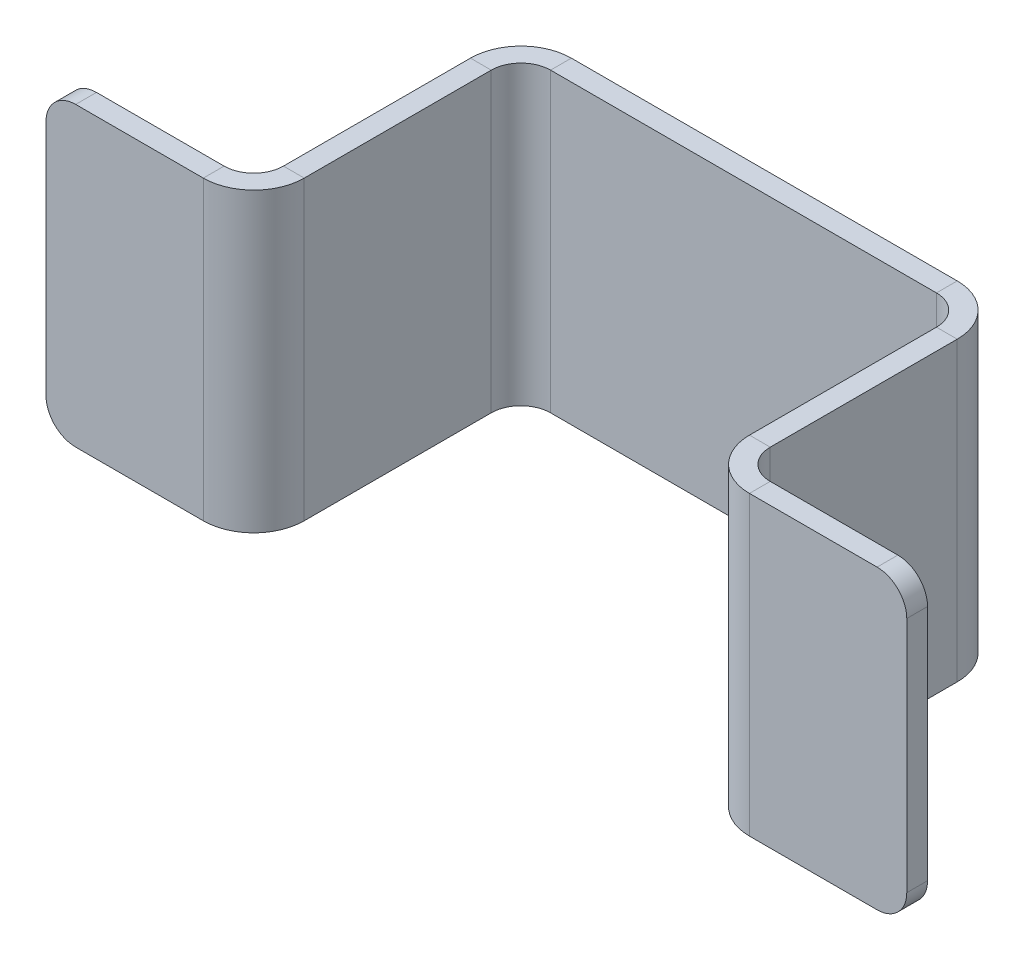
ISO-10303-21;
HEADER;
FILE_DESCRIPTION(('STEP AP214'),'2;1');
FILE_NAME('part.step','',(''),(''),'','','');
FILE_SCHEMA(('AUTOMOTIVE_DESIGN { 1 0 10303 214 1 1 1 1 }'));
ENDSEC;
DATA;
#1=APPLICATION_CONTEXT('core data for automotive mechanical design processes');
#2=APPLICATION_PROTOCOL_DEFINITION('international standard','automotive_design',2000,#1);
#3=PRODUCT_CONTEXT('',#1,'mechanical');
#4=PRODUCT('Part','Part','',(#3));
#5=PRODUCT_RELATED_PRODUCT_CATEGORY('part','',(#4));
#6=PRODUCT_DEFINITION_FORMATION('','',#4);
#7=PRODUCT_DEFINITION_CONTEXT('part definition',#1,'design');
#8=PRODUCT_DEFINITION('design','',#6,#7);
#9=PRODUCT_DEFINITION_SHAPE('','',#8);
#10=(LENGTH_UNIT() NAMED_UNIT(*) SI_UNIT(.MILLI.,.METRE.));
#11=(NAMED_UNIT(*) PLANE_ANGLE_UNIT() SI_UNIT($,.RADIAN.));
#12=(NAMED_UNIT(*) SI_UNIT($,.STERADIAN.) SOLID_ANGLE_UNIT());
#13=UNCERTAINTY_MEASURE_WITH_UNIT(LENGTH_MEASURE(1.E-05),#10,'distance_accuracy_value','');
#14=(GEOMETRIC_REPRESENTATION_CONTEXT(3) GLOBAL_UNCERTAINTY_ASSIGNED_CONTEXT((#13)) GLOBAL_UNIT_ASSIGNED_CONTEXT((#10,
#11,#12)) REPRESENTATION_CONTEXT('',''));
#15=CARTESIAN_POINT('',(0.,0.,0.));
#16=DIRECTION('',(0.,0.,1.));
#17=DIRECTION('',(1.,0.,0.));
#18=AXIS2_PLACEMENT_3D('',#15,#16,#17);
#19=CARTESIAN_POINT('',(-8.2,5.,0.));
#20=DIRECTION('',(0.,-1.,0.));
#21=DIRECTION('',(1.,0.,0.));
#22=AXIS2_PLACEMENT_3D('',#19,#20,#21);
#23=PLANE('',#22);
#24=DIRECTION('',(1.,0.,0.));
#25=VECTOR('',#24,1.);
#26=CARTESIAN_POINT('',(-8.20000000000002,4.99999999999999,7.3));
#27=LINE('',#26,#25);
#28=CARTESIAN_POINT('',(-8.20000000000002,4.99999999999999,7.3));
#29=VERTEX_POINT('',#28);
#30=CARTESIAN_POINT('',(-7.50000000000002,4.99999999999999,7.30000000000001));
#31=VERTEX_POINT('',#30);
#32=EDGE_CURVE('E253',#29,#31,#27,.T.);
#33=ORIENTED_EDGE('',*,*,#32,.T.);
#34=DIRECTION('',(0.,0.,-1.));
#35=VECTOR('',#34,1.);
#36=CARTESIAN_POINT('',(-7.5,5.,0.));
#37=LINE('',#36,#35);
#38=CARTESIAN_POINT('',(-7.5,4.99999999999999,0.999999999999997));
#39=VERTEX_POINT('',#38);
#40=EDGE_CURVE('E366',#31,#39,#37,.T.);
#41=ORIENTED_EDGE('',*,*,#40,.T.);
#42=DIRECTION('',(-1.,0.,0.));
#43=VECTOR('',#42,1.);
#44=CARTESIAN_POINT('',(-7.5,4.99999999999999,0.999999999999997));
#45=LINE('',#44,#43);
#46=CARTESIAN_POINT('',(-8.2,4.99999999999999,0.999999999999994));
#47=VERTEX_POINT('',#46);
#48=EDGE_CURVE('E353',#39,#47,#45,.T.);
#49=ORIENTED_EDGE('',*,*,#48,.T.);
#50=DIRECTION('',(0.,0.,-1.));
#51=VECTOR('',#50,1.);
#52=CARTESIAN_POINT('',(-8.2,5.,0.));
#53=LINE('',#52,#51);
#54=EDGE_CURVE('E367',#29,#47,#53,.T.);
#55=ORIENTED_EDGE('',*,*,#54,.F.);
#56=EDGE_LOOP('',(#33,#41,#49,#55));
#57=FACE_BOUND('',#56,.T.);
#58=ADVANCED_FACE('F39',(#57),#23,.F.);
#59=CARTESIAN_POINT('',(-8.20000000000002,-5.,8.3));
#60=DIRECTION('',(0.,1.,0.));
#61=DIRECTION('',(-1.,0.,0.));
#62=AXIS2_PLACEMENT_3D('',#59,#60,#61);
#63=PLANE('',#62);
#64=DIRECTION('',(1.,0.,0.));
#65=VECTOR('',#64,1.);
#66=CARTESIAN_POINT('',(-8.20000000000002,-5.,7.3));
#67=LINE('',#66,#65);
#68=CARTESIAN_POINT('',(-8.20000000000002,-5.,7.3));
#69=VERTEX_POINT('',#68);
#70=CARTESIAN_POINT('',(-7.50000000000002,-5.,7.3));
#71=VERTEX_POINT('',#70);
#72=EDGE_CURVE('E260',#69,#71,#67,.T.);
#73=ORIENTED_EDGE('',*,*,#72,.F.);
#74=DIRECTION('',(0.,0.,1.));
#75=VECTOR('',#74,1.);
#76=CARTESIAN_POINT('',(-8.20000000000002,-5.,8.3));
#77=LINE('',#76,#75);
#78=CARTESIAN_POINT('',(-8.2,-5.,0.999999999999994));
#79=VERTEX_POINT('',#78);
#80=EDGE_CURVE('E369',#79,#69,#77,.T.);
#81=ORIENTED_EDGE('',*,*,#80,.F.);
#82=DIRECTION('',(-1.,0.,0.));
#83=VECTOR('',#82,1.);
#84=CARTESIAN_POINT('',(-7.5,-5.,0.999999999999997));
#85=LINE('',#84,#83);
#86=CARTESIAN_POINT('',(-7.5,-5.,0.999999999999997));
#87=VERTEX_POINT('',#86);
#88=EDGE_CURVE('E358',#87,#79,#85,.T.);
#89=ORIENTED_EDGE('',*,*,#88,.F.);
#90=DIRECTION('',(0.,0.,1.));
#91=VECTOR('',#90,1.);
#92=CARTESIAN_POINT('',(-7.50000000000002,-5.,8.3));
#93=LINE('',#92,#91);
#94=EDGE_CURVE('E370',#87,#71,#93,.T.);
#95=ORIENTED_EDGE('',*,*,#94,.T.);
#96=EDGE_LOOP('',(#73,#81,#89,#95));
#97=FACE_BOUND('',#96,.T.);
#98=ADVANCED_FACE('F527',(#97),#63,.F.);
#99=CARTESIAN_POINT('',(-8.2,0.,0.));
#100=DIRECTION('',(1.,0.,0.));
#101=DIRECTION('',(0.,0.,-1.));
#102=AXIS2_PLACEMENT_3D('',#99,#100,#101);
#103=PLANE('',#102);
#104=DIRECTION('',(0.,1.,0.));
#105=VECTOR('',#104,1.);
#106=CARTESIAN_POINT('',(-8.20000000000002,4.99999999999999,7.3));
#107=LINE('',#106,#105);
#108=EDGE_CURVE('E257',#29,#69,#107,.F.);
#109=ORIENTED_EDGE('',*,*,#108,.F.);
#110=ORIENTED_EDGE('',*,*,#54,.T.);
#111=DIRECTION('',(0.,1.,0.));
#112=VECTOR('',#111,1.);
#113=CARTESIAN_POINT('',(-8.2,0.,0.999999999999994));
#114=LINE('',#113,#112);
#115=EDGE_CURVE('E361',#79,#47,#114,.T.);
#116=ORIENTED_EDGE('',*,*,#115,.F.);
#117=ORIENTED_EDGE('',*,*,#80,.T.);
#118=EDGE_LOOP('',(#109,#110,#116,#117));
#119=FACE_BOUND('',#118,.T.);
#120=ADVANCED_FACE('F524',(#119),#103,.F.);
#121=CARTESIAN_POINT('',(-7.5,0.,0.));
#122=DIRECTION('',(1.,0.,0.));
#123=DIRECTION('',(0.,0.,-1.));
#124=AXIS2_PLACEMENT_3D('',#121,#122,#123);
#125=PLANE('',#124);
#126=ORIENTED_EDGE('',*,*,#40,.F.);
#127=DIRECTION('',(0.,1.,0.));
#128=VECTOR('',#127,1.);
#129=CARTESIAN_POINT('',(-7.50000000000002,4.99999999999999,7.30000000000001));
#130=LINE('',#129,#128);
#131=EDGE_CURVE('E210',#31,#71,#130,.F.);
#132=ORIENTED_EDGE('',*,*,#131,.T.);
#133=ORIENTED_EDGE('',*,*,#94,.F.);
#134=DIRECTION('',(0.,-1.,0.));
#135=VECTOR('',#134,1.);
#136=CARTESIAN_POINT('',(-7.5,4.99999999999999,0.999999999999997));
#137=LINE('',#136,#135);
#138=EDGE_CURVE('E356',#39,#87,#137,.T.);
#139=ORIENTED_EDGE('',*,*,#138,.F.);
#140=EDGE_LOOP('',(#126,#132,#133,#139));
#141=FACE_BOUND('',#140,.T.);
#142=ADVANCED_FACE('F535',(#141),#125,.T.);
#143=CARTESIAN_POINT('',(8.2,-5.,0.));
#144=DIRECTION('',(0.,1.,0.));
#145=DIRECTION('',(-1.,0.,0.));
#146=AXIS2_PLACEMENT_3D('',#143,#144,#145);
#147=PLANE('',#146);
#148=DIRECTION('',(-1.,0.,0.));
#149=VECTOR('',#148,1.);
#150=CARTESIAN_POINT('',(8.20000000000002,-4.99999999999999,7.3));
#151=LINE('',#150,#149);
#152=CARTESIAN_POINT('',(8.20000000000002,-4.99999999999999,7.3));
#153=VERTEX_POINT('',#152);
#154=CARTESIAN_POINT('',(7.50000000000002,-4.99999999999999,7.30000000000001));
#155=VERTEX_POINT('',#154);
#156=EDGE_CURVE('E296',#153,#155,#151,.T.);
#157=ORIENTED_EDGE('',*,*,#156,.T.);
#158=DIRECTION('',(0.,0.,-1.));
#159=VECTOR('',#158,1.);
#160=CARTESIAN_POINT('',(7.5,-5.,0.));
#161=LINE('',#160,#159);
#162=CARTESIAN_POINT('',(7.50000000000001,-5.,0.999999999999997));
#163=VERTEX_POINT('',#162);
#164=EDGE_CURVE('E322',#155,#163,#161,.T.);
#165=ORIENTED_EDGE('',*,*,#164,.T.);
#166=DIRECTION('',(1.,0.,0.));
#167=VECTOR('',#166,1.);
#168=CARTESIAN_POINT('',(7.50000000000001,-4.99999999999999,0.999999999999997));
#169=LINE('',#168,#167);
#170=CARTESIAN_POINT('',(8.20000000000001,-5.,0.999999999999994));
#171=VERTEX_POINT('',#170);
#172=EDGE_CURVE('E309',#163,#171,#169,.T.);
#173=ORIENTED_EDGE('',*,*,#172,.T.);
#174=DIRECTION('',(0.,0.,-1.));
#175=VECTOR('',#174,1.);
#176=CARTESIAN_POINT('',(8.2,-5.,0.));
#177=LINE('',#176,#175);
#178=EDGE_CURVE('E323',#153,#171,#177,.T.);
#179=ORIENTED_EDGE('',*,*,#178,.F.);
#180=EDGE_LOOP('',(#157,#165,#173,#179));
#181=FACE_BOUND('',#180,.T.);
#182=ADVANCED_FACE('F489',(#181),#147,.F.);
#183=CARTESIAN_POINT('',(8.20000000000002,5.,8.3));
#184=DIRECTION('',(0.,-1.,0.));
#185=DIRECTION('',(1.,0.,0.));
#186=AXIS2_PLACEMENT_3D('',#183,#184,#185);
#187=PLANE('',#186);
#188=DIRECTION('',(-1.,0.,0.));
#189=VECTOR('',#188,1.);
#190=CARTESIAN_POINT('',(8.20000000000002,5.,7.3));
#191=LINE('',#190,#189);
#192=CARTESIAN_POINT('',(8.20000000000002,5.,7.3));
#193=VERTEX_POINT('',#192);
#194=CARTESIAN_POINT('',(7.50000000000002,5.,7.3));
#195=VERTEX_POINT('',#194);
#196=EDGE_CURVE('E306',#193,#195,#191,.T.);
#197=ORIENTED_EDGE('',*,*,#196,.F.);
#198=DIRECTION('',(0.,0.,1.));
#199=VECTOR('',#198,1.);
#200=CARTESIAN_POINT('',(8.20000000000002,5.,8.3));
#201=LINE('',#200,#199);
#202=CARTESIAN_POINT('',(8.2,5.,0.999999999999993));
#203=VERTEX_POINT('',#202);
#204=EDGE_CURVE('E325',#203,#193,#201,.T.);
#205=ORIENTED_EDGE('',*,*,#204,.F.);
#206=DIRECTION('',(1.,0.,0.));
#207=VECTOR('',#206,1.);
#208=CARTESIAN_POINT('',(7.5,5.,0.999999999999996));
#209=LINE('',#208,#207);
#210=CARTESIAN_POINT('',(7.5,5.,0.999999999999996));
#211=VERTEX_POINT('',#210);
#212=EDGE_CURVE('E314',#211,#203,#209,.T.);
#213=ORIENTED_EDGE('',*,*,#212,.F.);
#214=DIRECTION('',(0.,0.,1.));
#215=VECTOR('',#214,1.);
#216=CARTESIAN_POINT('',(7.50000000000002,5.,8.3));
#217=LINE('',#216,#215);
#218=EDGE_CURVE('E326',#211,#195,#217,.T.);
#219=ORIENTED_EDGE('',*,*,#218,.T.);
#220=EDGE_LOOP('',(#197,#205,#213,#219));
#221=FACE_BOUND('',#220,.T.);
#222=ADVANCED_FACE('F473',(#221),#187,.F.);
#223=CARTESIAN_POINT('',(8.2,0.,0.));
#224=DIRECTION('',(-1.,0.,0.));
#225=DIRECTION('',(0.,0.,1.));
#226=AXIS2_PLACEMENT_3D('',#223,#224,#225);
#227=PLANE('',#226);
#228=DIRECTION('',(0.,-1.,0.));
#229=VECTOR('',#228,1.);
#230=CARTESIAN_POINT('',(8.20000000000002,-4.99999999999999,7.3));
#231=LINE('',#230,#229);
#232=EDGE_CURVE('E302',#153,#193,#231,.F.);
#233=ORIENTED_EDGE('',*,*,#232,.F.);
#234=ORIENTED_EDGE('',*,*,#178,.T.);
#235=DIRECTION('',(0.,-1.,0.));
#236=VECTOR('',#235,1.);
#237=CARTESIAN_POINT('',(8.2,0.,0.999999999999994));
#238=LINE('',#237,#236);
#239=EDGE_CURVE('E317',#203,#171,#238,.T.);
#240=ORIENTED_EDGE('',*,*,#239,.F.);
#241=ORIENTED_EDGE('',*,*,#204,.T.);
#242=EDGE_LOOP('',(#233,#234,#240,#241));
#243=FACE_BOUND('',#242,.T.);
#244=ADVANCED_FACE('F478',(#243),#227,.F.);
#245=CARTESIAN_POINT('',(7.5,0.,0.));
#246=DIRECTION('',(-1.,0.,0.));
#247=DIRECTION('',(0.,0.,1.));
#248=AXIS2_PLACEMENT_3D('',#245,#246,#247);
#249=PLANE('',#248);
#250=ORIENTED_EDGE('',*,*,#164,.F.);
#251=DIRECTION('',(0.,-1.,0.));
#252=VECTOR('',#251,1.);
#253=CARTESIAN_POINT('',(7.50000000000002,-4.99999999999999,7.30000000000001));
#254=LINE('',#253,#252);
#255=EDGE_CURVE('E289',#155,#195,#254,.F.);
#256=ORIENTED_EDGE('',*,*,#255,.T.);
#257=ORIENTED_EDGE('',*,*,#218,.F.);
#258=DIRECTION('',(0.,1.,0.));
#259=VECTOR('',#258,1.);
#260=CARTESIAN_POINT('',(7.50000000000001,-4.99999999999999,0.999999999999997));
#261=LINE('',#260,#259);
#262=EDGE_CURVE('E312',#163,#211,#261,.T.);
#263=ORIENTED_EDGE('',*,*,#262,.F.);
#264=EDGE_LOOP('',(#250,#256,#257,#263));
#265=FACE_BOUND('',#264,.T.);
#266=ADVANCED_FACE('F493',(#265),#249,.T.);
#267=CARTESIAN_POINT('',(0.,0.,-0.7));
#268=DIRECTION('',(0.,0.,1.));
#269=DIRECTION('',(1.,0.,0.));
#270=AXIS2_PLACEMENT_3D('',#267,#268,#269);
#271=PLANE('',#270);
#272=DIRECTION('',(0.,1.,0.));
#273=VECTOR('',#272,1.);
#274=CARTESIAN_POINT('',(6.5,5.,-0.7));
#275=LINE('',#274,#273);
#276=CARTESIAN_POINT('',(6.5,5.,-0.7));
#277=VERTEX_POINT('',#276);
#278=CARTESIAN_POINT('',(6.50000000000001,-4.99999999999999,-0.7));
#279=VERTEX_POINT('',#278);
#280=EDGE_CURVE('E333',#277,#279,#275,.F.);
#281=ORIENTED_EDGE('',*,*,#280,.T.);
#282=DIRECTION('',(1.,0.,0.));
#283=VECTOR('',#282,1.);
#284=CARTESIAN_POINT('',(-7.5,-5.,-0.7));
#285=LINE('',#284,#283);
#286=CARTESIAN_POINT('',(-6.5,-5.,-0.7));
#287=VERTEX_POINT('',#286);
#288=EDGE_CURVE('E403',#287,#279,#285,.T.);
#289=ORIENTED_EDGE('',*,*,#288,.F.);
#290=DIRECTION('',(0.,-1.,0.));
#291=VECTOR('',#290,1.);
#292=CARTESIAN_POINT('',(-6.5,-5.,-0.7));
#293=LINE('',#292,#291);
#294=CARTESIAN_POINT('',(-6.5,5.,-0.7));
#295=VERTEX_POINT('',#294);
#296=EDGE_CURVE('E377',#287,#295,#293,.F.);
#297=ORIENTED_EDGE('',*,*,#296,.T.);
#298=DIRECTION('',(-1.,0.,0.));
#299=VECTOR('',#298,1.);
#300=CARTESIAN_POINT('',(-7.5,5.,-0.7));
#301=LINE('',#300,#299);
#302=EDGE_CURVE('E401',#277,#295,#301,.T.);
#303=ORIENTED_EDGE('',*,*,#302,.F.);
#304=EDGE_LOOP('',(#281,#289,#297,#303));
#305=FACE_BOUND('',#304,.T.);
#306=ADVANCED_FACE('F505',(#305),#271,.F.);
#307=CARTESIAN_POINT('',(0.,0.,0.));
#308=DIRECTION('',(0.,0.,1.));
#309=DIRECTION('',(1.,0.,0.));
#310=AXIS2_PLACEMENT_3D('',#307,#308,#309);
#311=PLANE('',#310);
#312=DIRECTION('',(1.,0.,0.));
#313=VECTOR('',#312,1.);
#314=CARTESIAN_POINT('',(-7.5,-5.,0.));
#315=LINE('',#314,#313);
#316=CARTESIAN_POINT('',(-6.5,-5.,0.));
#317=VERTEX_POINT('',#316);
#318=CARTESIAN_POINT('',(6.50000000000001,-5.,0.));
#319=VERTEX_POINT('',#318);
#320=EDGE_CURVE('E404',#317,#319,#315,.T.);
#321=ORIENTED_EDGE('',*,*,#320,.T.);
#322=DIRECTION('',(0.,1.,0.));
#323=VECTOR('',#322,1.);
#324=CARTESIAN_POINT('',(6.5,5.,0.));
#325=LINE('',#324,#323);
#326=CARTESIAN_POINT('',(6.5,5.,0.));
#327=VERTEX_POINT('',#326);
#328=EDGE_CURVE('E345',#327,#319,#325,.F.);
#329=ORIENTED_EDGE('',*,*,#328,.F.);
#330=DIRECTION('',(-1.,0.,0.));
#331=VECTOR('',#330,1.);
#332=CARTESIAN_POINT('',(-7.5,5.,0.));
#333=LINE('',#332,#331);
#334=CARTESIAN_POINT('',(-6.5,4.99999999999999,0.));
#335=VERTEX_POINT('',#334);
#336=EDGE_CURVE('E398',#327,#335,#333,.T.);
#337=ORIENTED_EDGE('',*,*,#336,.T.);
#338=DIRECTION('',(0.,-1.,0.));
#339=VECTOR('',#338,1.);
#340=CARTESIAN_POINT('',(-6.5,-5.,0.));
#341=LINE('',#340,#339);
#342=EDGE_CURVE('E390',#317,#335,#341,.F.);
#343=ORIENTED_EDGE('',*,*,#342,.F.);
#344=EDGE_LOOP('',(#321,#329,#337,#343));
#345=FACE_BOUND('',#344,.T.);
#346=ADVANCED_FACE('F545',(#345),#311,.T.);
#347=CARTESIAN_POINT('',(-7.5,5.,-0.7));
#348=DIRECTION('',(0.,1.,0.));
#349=DIRECTION('',(0.,0.,1.));
#350=AXIS2_PLACEMENT_3D('',#347,#348,#349);
#351=PLANE('',#350);
#352=ORIENTED_EDGE('',*,*,#336,.F.);
#353=DIRECTION('',(0.,0.,-1.));
#354=VECTOR('',#353,1.);
#355=CARTESIAN_POINT('',(6.5,5.,0.));
#356=LINE('',#355,#354);
#357=EDGE_CURVE('E339',#327,#277,#356,.T.);
#358=ORIENTED_EDGE('',*,*,#357,.T.);
#359=ORIENTED_EDGE('',*,*,#302,.T.);
#360=DIRECTION('',(0.,0.,-1.));
#361=VECTOR('',#360,1.);
#362=CARTESIAN_POINT('',(-6.5,4.99999999999999,0.));
#363=LINE('',#362,#361);
#364=EDGE_CURVE('E395',#335,#295,#363,.T.);
#365=ORIENTED_EDGE('',*,*,#364,.F.);
#366=EDGE_LOOP('',(#352,#358,#359,#365));
#367=FACE_BOUND('',#366,.T.);
#368=ADVANCED_FACE('F502',(#367),#351,.T.);
#369=CARTESIAN_POINT('',(-7.5,-5.,-0.7));
#370=DIRECTION('',(0.,-1.,0.));
#371=DIRECTION('',(0.,0.,-1.));
#372=AXIS2_PLACEMENT_3D('',#369,#370,#371);
#373=PLANE('',#372);
#374=DIRECTION('',(0.,0.,-1.));
#375=VECTOR('',#374,1.);
#376=CARTESIAN_POINT('',(6.50000000000001,-5.,0.));
#377=LINE('',#376,#375);
#378=EDGE_CURVE('E350',#319,#279,#377,.T.);
#379=ORIENTED_EDGE('',*,*,#378,.F.);
#380=ORIENTED_EDGE('',*,*,#320,.F.);
#381=DIRECTION('',(0.,0.,-1.));
#382=VECTOR('',#381,1.);
#383=CARTESIAN_POINT('',(-6.5,-5.,0.));
#384=LINE('',#383,#382);
#385=EDGE_CURVE('E384',#317,#287,#384,.T.);
#386=ORIENTED_EDGE('',*,*,#385,.T.);
#387=ORIENTED_EDGE('',*,*,#288,.T.);
#388=EDGE_LOOP('',(#379,#380,#386,#387));
#389=FACE_BOUND('',#388,.T.);
#390=ADVANCED_FACE('F507',(#389),#373,.T.);
#391=CARTESIAN_POINT('',(-6.5,4.99999999999999,1.));
#392=DIRECTION('',(0.,1.,0.));
#393=DIRECTION('',(-1.,0.,0.));
#394=AXIS2_PLACEMENT_3D('',#391,#392,#393);
#395=PLANE('',#394);
#396=ORIENTED_EDGE('',*,*,#48,.F.);
#397=CARTESIAN_POINT('',(-6.5,4.99999999999999,1.));
#398=DIRECTION('',(0.,-1.,0.));
#399=DIRECTION('',(1.,0.,0.));
#400=AXIS2_PLACEMENT_3D('',#397,#398,#399);
#401=CIRCLE('',#400,1.);
#402=EDGE_CURVE('E387',#335,#39,#401,.F.);
#403=ORIENTED_EDGE('',*,*,#402,.F.);
#404=ORIENTED_EDGE('',*,*,#364,.T.);
#405=CARTESIAN_POINT('',(-6.5,4.99999999999999,1.));
#406=DIRECTION('',(0.,-1.,0.));
#407=DIRECTION('',(1.,0.,0.));
#408=AXIS2_PLACEMENT_3D('',#405,#406,#407);
#409=CIRCLE('',#408,1.7);
#410=EDGE_CURVE('E380',#295,#47,#409,.F.);
#411=ORIENTED_EDGE('',*,*,#410,.T.);
#412=EDGE_LOOP('',(#396,#403,#404,#411));
#413=FACE_BOUND('',#412,.T.);
#414=ADVANCED_FACE('F541',(#413),#395,.T.);
#415=CARTESIAN_POINT('',(-6.5,-5.,1.));
#416=DIRECTION('',(0.,1.,0.));
#417=DIRECTION('',(-1.,0.,0.));
#418=AXIS2_PLACEMENT_3D('',#415,#416,#417);
#419=PLANE('',#418);
#420=CARTESIAN_POINT('',(-6.5,-5.,1.));
#421=DIRECTION('',(0.,-1.,0.));
#422=DIRECTION('',(1.,0.,0.));
#423=AXIS2_PLACEMENT_3D('',#420,#421,#422);
#424=CIRCLE('',#423,1.);
#425=EDGE_CURVE('E373',#87,#317,#424,.T.);
#426=ORIENTED_EDGE('',*,*,#425,.F.);
#427=ORIENTED_EDGE('',*,*,#88,.T.);
#428=CARTESIAN_POINT('',(-6.5,-5.,1.));
#429=DIRECTION('',(0.,-1.,0.));
#430=DIRECTION('',(1.,0.,0.));
#431=AXIS2_PLACEMENT_3D('',#428,#429,#430);
#432=CIRCLE('',#431,1.7);
#433=EDGE_CURVE('E381',#79,#287,#432,.T.);
#434=ORIENTED_EDGE('',*,*,#433,.T.);
#435=ORIENTED_EDGE('',*,*,#385,.F.);
#436=EDGE_LOOP('',(#426,#427,#434,#435));
#437=FACE_BOUND('',#436,.T.);
#438=ADVANCED_FACE('F516',(#437),#419,.F.);
#439=CARTESIAN_POINT('',(-6.5,-5.,1.));
#440=DIRECTION('',(0.,-1.,0.));
#441=DIRECTION('',(-1.,0.,0.));
#442=AXIS2_PLACEMENT_3D('',#439,#440,#441);
#443=CYLINDRICAL_SURFACE('',#442,1.7);
#444=ORIENTED_EDGE('',*,*,#296,.F.);
#445=ORIENTED_EDGE('',*,*,#433,.F.);
#446=ORIENTED_EDGE('',*,*,#115,.T.);
#447=ORIENTED_EDGE('',*,*,#410,.F.);
#448=EDGE_LOOP('',(#444,#445,#446,#447));
#449=FACE_BOUND('',#448,.T.);
#450=ADVANCED_FACE('F515',(#449),#443,.T.);
#451=CARTESIAN_POINT('',(-6.5,-5.,1.));
#452=DIRECTION('',(0.,-1.,0.));
#453=DIRECTION('',(-1.,0.,0.));
#454=AXIS2_PLACEMENT_3D('',#451,#452,#453);
#455=CYLINDRICAL_SURFACE('',#454,1.);
#456=ORIENTED_EDGE('',*,*,#342,.T.);
#457=ORIENTED_EDGE('',*,*,#402,.T.);
#458=ORIENTED_EDGE('',*,*,#138,.T.);
#459=ORIENTED_EDGE('',*,*,#425,.T.);
#460=EDGE_LOOP('',(#456,#457,#458,#459));
#461=FACE_BOUND('',#460,.T.);
#462=ADVANCED_FACE('F543',(#461),#455,.F.);
#463=CARTESIAN_POINT('',(6.50000000000001,-5.,1.));
#464=DIRECTION('',(0.,-1.,0.));
#465=DIRECTION('',(1.,0.,0.));
#466=AXIS2_PLACEMENT_3D('',#463,#464,#465);
#467=PLANE('',#466);
#468=ORIENTED_EDGE('',*,*,#172,.F.);
#469=CARTESIAN_POINT('',(6.50000000000001,-5.,1.));
#470=DIRECTION('',(0.,1.,0.));
#471=DIRECTION('',(-1.,0.,0.));
#472=AXIS2_PLACEMENT_3D('',#469,#470,#471);
#473=CIRCLE('',#472,0.999999999999999);
#474=EDGE_CURVE('E342',#319,#163,#473,.F.);
#475=ORIENTED_EDGE('',*,*,#474,.F.);
#476=ORIENTED_EDGE('',*,*,#378,.T.);
#477=CARTESIAN_POINT('',(6.50000000000001,-5.,1.));
#478=DIRECTION('',(0.,1.,0.));
#479=DIRECTION('',(-1.,0.,0.));
#480=AXIS2_PLACEMENT_3D('',#477,#478,#479);
#481=CIRCLE('',#480,1.7);
#482=EDGE_CURVE('E335',#279,#171,#481,.F.);
#483=ORIENTED_EDGE('',*,*,#482,.T.);
#484=EDGE_LOOP('',(#468,#475,#476,#483));
#485=FACE_BOUND('',#484,.T.);
#486=ADVANCED_FACE('F486',(#485),#467,.T.);
#487=CARTESIAN_POINT('',(6.5,5.,0.999999999999999));
#488=DIRECTION('',(0.,-1.,0.));
#489=DIRECTION('',(1.,0.,0.));
#490=AXIS2_PLACEMENT_3D('',#487,#488,#489);
#491=PLANE('',#490);
#492=CARTESIAN_POINT('',(6.5,5.,0.999999999999999));
#493=DIRECTION('',(0.,1.,0.));
#494=DIRECTION('',(-1.,0.,0.));
#495=AXIS2_PLACEMENT_3D('',#492,#493,#494);
#496=CIRCLE('',#495,0.999999999999999);
#497=EDGE_CURVE('E329',#211,#327,#496,.T.);
#498=ORIENTED_EDGE('',*,*,#497,.F.);
#499=ORIENTED_EDGE('',*,*,#212,.T.);
#500=CARTESIAN_POINT('',(6.5,5.,0.999999999999999));
#501=DIRECTION('',(0.,1.,0.));
#502=DIRECTION('',(-1.,0.,0.));
#503=AXIS2_PLACEMENT_3D('',#500,#501,#502);
#504=CIRCLE('',#503,1.7);
#505=EDGE_CURVE('E336',#203,#277,#504,.T.);
#506=ORIENTED_EDGE('',*,*,#505,.T.);
#507=ORIENTED_EDGE('',*,*,#357,.F.);
#508=EDGE_LOOP('',(#498,#499,#506,#507));
#509=FACE_BOUND('',#508,.T.);
#510=ADVANCED_FACE('F499',(#509),#491,.F.);
#511=CARTESIAN_POINT('',(6.5,5.,0.999999999999999));
#512=DIRECTION('',(0.,1.,0.));
#513=DIRECTION('',(1.,0.,0.));
#514=AXIS2_PLACEMENT_3D('',#511,#512,#513);
#515=CYLINDRICAL_SURFACE('',#514,1.7);
#516=ORIENTED_EDGE('',*,*,#280,.F.);
#517=ORIENTED_EDGE('',*,*,#505,.F.);
#518=ORIENTED_EDGE('',*,*,#239,.T.);
#519=ORIENTED_EDGE('',*,*,#482,.F.);
#520=EDGE_LOOP('',(#516,#517,#518,#519));
#521=FACE_BOUND('',#520,.T.);
#522=ADVANCED_FACE('F483',(#521),#515,.T.);
#523=CARTESIAN_POINT('',(6.5,5.,0.999999999999999));
#524=DIRECTION('',(0.,1.,0.));
#525=DIRECTION('',(1.,0.,0.));
#526=AXIS2_PLACEMENT_3D('',#523,#524,#525);
#527=CYLINDRICAL_SURFACE('',#526,0.999999999999999);
#528=ORIENTED_EDGE('',*,*,#328,.T.);
#529=ORIENTED_EDGE('',*,*,#474,.T.);
#530=ORIENTED_EDGE('',*,*,#262,.T.);
#531=ORIENTED_EDGE('',*,*,#497,.T.);
#532=EDGE_LOOP('',(#528,#529,#530,#531));
#533=FACE_BOUND('',#532,.T.);
#534=ADVANCED_FACE('F496',(#533),#527,.F.);
#535=CARTESIAN_POINT('',(9.20000000000002,5.,7.3));
#536=DIRECTION('',(0.,1.,0.));
#537=DIRECTION('',(0.,0.,1.));
#538=AXIS2_PLACEMENT_3D('',#535,#536,#537);
#539=PLANE('',#538);
#540=DIRECTION('',(0.,0.,1.));
#541=VECTOR('',#540,1.);
#542=CARTESIAN_POINT('',(9.20000000000002,5.,8.3));
#543=LINE('',#542,#541);
#544=CARTESIAN_POINT('',(9.20000000000002,5.,8.3));
#545=VERTEX_POINT('',#544);
#546=CARTESIAN_POINT('',(9.20000000000002,5.,9.));
#547=VERTEX_POINT('',#546);
#548=EDGE_CURVE('E263',#545,#547,#543,.T.);
#549=ORIENTED_EDGE('',*,*,#548,.F.);
#550=CARTESIAN_POINT('',(9.20000000000002,5.,7.3));
#551=DIRECTION('',(0.,-1.,0.));
#552=DIRECTION('',(0.,0.,-1.));
#553=AXIS2_PLACEMENT_3D('',#550,#551,#552);
#554=CIRCLE('',#553,1.);
#555=EDGE_CURVE('E299',#193,#545,#554,.F.);
#556=ORIENTED_EDGE('',*,*,#555,.F.);
#557=ORIENTED_EDGE('',*,*,#196,.T.);
#558=CARTESIAN_POINT('',(9.20000000000002,5.,7.3));
#559=DIRECTION('',(0.,-1.,0.));
#560=DIRECTION('',(0.,0.,-1.));
#561=AXIS2_PLACEMENT_3D('',#558,#559,#560);
#562=CIRCLE('',#561,1.7);
#563=EDGE_CURVE('E292',#195,#547,#562,.F.);
#564=ORIENTED_EDGE('',*,*,#563,.T.);
#565=EDGE_LOOP('',(#549,#556,#557,#564));
#566=FACE_BOUND('',#565,.T.);
#567=ADVANCED_FACE('F461',(#566),#539,.T.);
#568=CARTESIAN_POINT('',(9.20000000000002,-4.99999999999999,7.3));
#569=DIRECTION('',(0.,1.,0.));
#570=DIRECTION('',(0.,0.,1.));
#571=AXIS2_PLACEMENT_3D('',#568,#569,#570);
#572=PLANE('',#571);
#573=CARTESIAN_POINT('',(9.20000000000002,-4.99999999999999,7.3));
#574=DIRECTION('',(0.,-1.,0.));
#575=DIRECTION('',(0.,0.,-1.));
#576=AXIS2_PLACEMENT_3D('',#573,#574,#575);
#577=CIRCLE('',#576,1.);
#578=CARTESIAN_POINT('',(9.20000000000002,-4.99999999999999,8.3));
#579=VERTEX_POINT('',#578);
#580=EDGE_CURVE('E283',#579,#153,#577,.T.);
#581=ORIENTED_EDGE('',*,*,#580,.F.);
#582=DIRECTION('',(0.,0.,1.));
#583=VECTOR('',#582,1.);
#584=CARTESIAN_POINT('',(9.20000000000003,-4.99999999999999,8.3));
#585=LINE('',#584,#583);
#586=CARTESIAN_POINT('',(9.20000000000003,-4.99999999999999,9.));
#587=VERTEX_POINT('',#586);
#588=EDGE_CURVE('E267',#579,#587,#585,.T.);
#589=ORIENTED_EDGE('',*,*,#588,.T.);
#590=CARTESIAN_POINT('',(9.20000000000002,-4.99999999999999,7.3));
#591=DIRECTION('',(0.,-1.,0.));
#592=DIRECTION('',(0.,0.,-1.));
#593=AXIS2_PLACEMENT_3D('',#590,#591,#592);
#594=CIRCLE('',#593,1.7);
#595=EDGE_CURVE('E293',#587,#155,#594,.T.);
#596=ORIENTED_EDGE('',*,*,#595,.T.);
#597=ORIENTED_EDGE('',*,*,#156,.F.);
#598=EDGE_LOOP('',(#581,#589,#596,#597));
#599=FACE_BOUND('',#598,.T.);
#600=ADVANCED_FACE('F456',(#599),#572,.F.);
#601=CARTESIAN_POINT('',(9.20000000000002,-4.99999999999999,7.3));
#602=DIRECTION('',(0.,-1.,0.));
#603=DIRECTION('',(0.,0.,1.));
#604=AXIS2_PLACEMENT_3D('',#601,#602,#603);
#605=CYLINDRICAL_SURFACE('',#604,1.7);
#606=ORIENTED_EDGE('',*,*,#255,.F.);
#607=ORIENTED_EDGE('',*,*,#595,.F.);
#608=DIRECTION('',(0.,1.,0.));
#609=VECTOR('',#608,1.);
#610=CARTESIAN_POINT('',(9.20000000000002,0.,9.));
#611=LINE('',#610,#609);
#612=EDGE_CURVE('E270',#587,#547,#611,.T.);
#613=ORIENTED_EDGE('',*,*,#612,.T.);
#614=ORIENTED_EDGE('',*,*,#563,.F.);
#615=EDGE_LOOP('',(#606,#607,#613,#614));
#616=FACE_BOUND('',#615,.T.);
#617=ADVANCED_FACE('F458',(#616),#605,.T.);
#618=CARTESIAN_POINT('',(9.20000000000002,-4.99999999999999,7.3));
#619=DIRECTION('',(0.,-1.,0.));
#620=DIRECTION('',(0.,0.,1.));
#621=AXIS2_PLACEMENT_3D('',#618,#619,#620);
#622=CYLINDRICAL_SURFACE('',#621,1.);
#623=ORIENTED_EDGE('',*,*,#232,.T.);
#624=ORIENTED_EDGE('',*,*,#555,.T.);
#625=DIRECTION('',(0.,-1.,0.));
#626=VECTOR('',#625,1.);
#627=CARTESIAN_POINT('',(9.20000000000002,5.,8.3));
#628=LINE('',#627,#626);
#629=EDGE_CURVE('E265',#545,#579,#628,.T.);
#630=ORIENTED_EDGE('',*,*,#629,.T.);
#631=ORIENTED_EDGE('',*,*,#580,.T.);
#632=EDGE_LOOP('',(#623,#624,#630,#631));
#633=FACE_BOUND('',#632,.T.);
#634=ADVANCED_FACE('F469',(#633),#622,.F.);
#635=CARTESIAN_POINT('',(8.20000000000002,5.,9.));
#636=DIRECTION('',(0.,-1.,0.));
#637=DIRECTION('',(1.,0.,0.));
#638=AXIS2_PLACEMENT_3D('',#635,#636,#637);
#639=PLANE('',#638);
#640=DIRECTION('',(-1.,0.,0.));
#641=VECTOR('',#640,1.);
#642=CARTESIAN_POINT('',(8.20000000000002,5.,9.));
#643=LINE('',#642,#641);
#644=CARTESIAN_POINT('',(13.5,5.00000000000001,9.));
#645=VERTEX_POINT('',#644);
#646=EDGE_CURVE('E276',#645,#547,#643,.T.);
#647=ORIENTED_EDGE('',*,*,#646,.F.);
#648=DIRECTION('',(0.,0.,-1.));
#649=VECTOR('',#648,1.);
#650=CARTESIAN_POINT('',(13.5,5.00000000000001,9.));
#651=LINE('',#650,#649);
#652=CARTESIAN_POINT('',(13.5,5.00000000000001,8.3));
#653=VERTEX_POINT('',#652);
#654=EDGE_CURVE('E11',#645,#653,#651,.T.);
#655=ORIENTED_EDGE('',*,*,#654,.T.);
#656=DIRECTION('',(-1.,0.,0.));
#657=VECTOR('',#656,1.);
#658=CARTESIAN_POINT('',(8.20000000000002,5.,8.3));
#659=LINE('',#658,#657);
#660=EDGE_CURVE('E275',#653,#545,#659,.T.);
#661=ORIENTED_EDGE('',*,*,#660,.T.);
#662=ORIENTED_EDGE('',*,*,#548,.T.);
#663=EDGE_LOOP('',(#647,#655,#661,#662));
#664=FACE_BOUND('',#663,.T.);
#665=ADVANCED_FACE('F465',(#664),#639,.F.);
#666=CARTESIAN_POINT('',(14.5,-4.99999999999999,9.));
#667=DIRECTION('',(0.,1.,0.));
#668=DIRECTION('',(-1.,0.,0.));
#669=AXIS2_PLACEMENT_3D('',#666,#667,#668);
#670=PLANE('',#669);
#671=DIRECTION('',(1.,0.,0.));
#672=VECTOR('',#671,1.);
#673=CARTESIAN_POINT('',(14.5,-4.99999999999999,8.3));
#674=LINE('',#673,#672);
#675=CARTESIAN_POINT('',(13.5,-4.99999999999999,8.3));
#676=VERTEX_POINT('',#675);
#677=EDGE_CURVE('E285',#579,#676,#674,.T.);
#678=ORIENTED_EDGE('',*,*,#677,.T.);
#679=DIRECTION('',(0.,0.,-1.));
#680=VECTOR('',#679,1.);
#681=CARTESIAN_POINT('',(13.5,-4.99999999999999,9.));
#682=LINE('',#681,#680);
#683=CARTESIAN_POINT('',(13.5,-4.99999999999999,9.));
#684=VERTEX_POINT('',#683);
#685=EDGE_CURVE('E62',#676,#684,#682,.F.);
#686=ORIENTED_EDGE('',*,*,#685,.T.);
#687=DIRECTION('',(1.,0.,0.));
#688=VECTOR('',#687,1.);
#689=CARTESIAN_POINT('',(14.5,-4.99999999999999,9.));
#690=LINE('',#689,#688);
#691=EDGE_CURVE('E278',#587,#684,#690,.T.);
#692=ORIENTED_EDGE('',*,*,#691,.F.);
#693=ORIENTED_EDGE('',*,*,#588,.F.);
#694=EDGE_LOOP('',(#678,#686,#692,#693));
#695=FACE_BOUND('',#694,.T.);
#696=ADVANCED_FACE('F453',(#695),#670,.F.);
#697=CARTESIAN_POINT('',(0.,0.,9.));
#698=DIRECTION('',(0.,0.,-1.));
#699=DIRECTION('',(-1.,0.,0.));
#700=AXIS2_PLACEMENT_3D('',#697,#698,#699);
#701=PLANE('',#700);
#702=ORIENTED_EDGE('',*,*,#691,.T.);
#703=CARTESIAN_POINT('',(13.5,-3.99999999999999,9.));
#704=DIRECTION('',(0.,0.,-1.));
#705=DIRECTION('',(-1.,0.,0.));
#706=AXIS2_PLACEMENT_3D('',#703,#704,#705);
#707=CIRCLE('',#706,1.);
#708=CARTESIAN_POINT('',(14.5,-3.99999999999999,9.));
#709=VERTEX_POINT('',#708);
#710=EDGE_CURVE('E47',#684,#709,#707,.F.);
#711=ORIENTED_EDGE('',*,*,#710,.T.);
#712=DIRECTION('',(0.,1.,0.));
#713=VECTOR('',#712,1.);
#714=CARTESIAN_POINT('',(14.5,5.00000000000001,9.));
#715=LINE('',#714,#713);
#716=CARTESIAN_POINT('',(14.5,4.00000000000001,9.));
#717=VERTEX_POINT('',#716);
#718=EDGE_CURVE('E281',#709,#717,#715,.T.);
#719=ORIENTED_EDGE('',*,*,#718,.T.);
#720=CARTESIAN_POINT('',(13.5,4.00000000000001,9.));
#721=DIRECTION('',(0.,0.,-1.));
#722=DIRECTION('',(-1.,0.,0.));
#723=AXIS2_PLACEMENT_3D('',#720,#721,#722);
#724=CIRCLE('',#723,1.);
#725=EDGE_CURVE('E54',#717,#645,#724,.F.);
#726=ORIENTED_EDGE('',*,*,#725,.T.);
#727=ORIENTED_EDGE('',*,*,#646,.T.);
#728=ORIENTED_EDGE('',*,*,#612,.F.);
#729=EDGE_LOOP('',(#702,#711,#719,#726,#727,#728));
#730=FACE_BOUND('',#729,.T.);
#731=ADVANCED_FACE('F439',(#730),#701,.F.);
#732=CARTESIAN_POINT('',(0.,0.,8.3));
#733=DIRECTION('',(0.,0.,-1.));
#734=DIRECTION('',(-1.,0.,0.));
#735=AXIS2_PLACEMENT_3D('',#732,#733,#734);
#736=PLANE('',#735);
#737=DIRECTION('',(0.,1.,0.));
#738=VECTOR('',#737,1.);
#739=CARTESIAN_POINT('',(14.5,5.00000000000001,8.3));
#740=LINE('',#739,#738);
#741=CARTESIAN_POINT('',(14.5,-3.99999999999999,8.3));
#742=VERTEX_POINT('',#741);
#743=CARTESIAN_POINT('',(14.5,4.00000000000001,8.3));
#744=VERTEX_POINT('',#743);
#745=EDGE_CURVE('E279',#742,#744,#740,.T.);
#746=ORIENTED_EDGE('',*,*,#745,.F.);
#747=CARTESIAN_POINT('',(13.5,-3.99999999999999,8.3));
#748=DIRECTION('',(0.,0.,-1.));
#749=DIRECTION('',(-1.,0.,0.));
#750=AXIS2_PLACEMENT_3D('',#747,#748,#749);
#751=CIRCLE('',#750,1.);
#752=EDGE_CURVE('E434',#742,#676,#751,.T.);
#753=ORIENTED_EDGE('',*,*,#752,.T.);
#754=ORIENTED_EDGE('',*,*,#677,.F.);
#755=ORIENTED_EDGE('',*,*,#629,.F.);
#756=ORIENTED_EDGE('',*,*,#660,.F.);
#757=CARTESIAN_POINT('',(13.5,4.00000000000001,8.3));
#758=DIRECTION('',(0.,0.,-1.));
#759=DIRECTION('',(-1.,0.,0.));
#760=AXIS2_PLACEMENT_3D('',#757,#758,#759);
#761=CIRCLE('',#760,1.);
#762=EDGE_CURVE('E432',#653,#744,#761,.T.);
#763=ORIENTED_EDGE('',*,*,#762,.T.);
#764=EDGE_LOOP('',(#746,#753,#754,#755,#756,#763));
#765=FACE_BOUND('',#764,.T.);
#766=ADVANCED_FACE('F450',(#765),#736,.T.);
#767=CARTESIAN_POINT('',(14.5,5.00000000000001,9.));
#768=DIRECTION('',(-1.,0.,0.));
#769=DIRECTION('',(0.,-1.,0.));
#770=AXIS2_PLACEMENT_3D('',#767,#768,#769);
#771=PLANE('',#770);
#772=ORIENTED_EDGE('',*,*,#718,.F.);
#773=DIRECTION('',(0.,0.,-1.));
#774=VECTOR('',#773,1.);
#775=CARTESIAN_POINT('',(14.5,-3.99999999999999,9.));
#776=LINE('',#775,#774);
#777=EDGE_CURVE('E429',#709,#742,#776,.T.);
#778=ORIENTED_EDGE('',*,*,#777,.T.);
#779=ORIENTED_EDGE('',*,*,#745,.T.);
#780=DIRECTION('',(0.,0.,-1.));
#781=VECTOR('',#780,1.);
#782=CARTESIAN_POINT('',(14.5,4.00000000000001,9.));
#783=LINE('',#782,#781);
#784=EDGE_CURVE('E427',#744,#717,#783,.F.);
#785=ORIENTED_EDGE('',*,*,#784,.T.);
#786=EDGE_LOOP('',(#772,#778,#779,#785));
#787=FACE_BOUND('',#786,.T.);
#788=ADVANCED_FACE('F444',(#787),#771,.F.);
#789=CARTESIAN_POINT('',(-9.20000000000002,-5.,7.3));
#790=DIRECTION('',(0.,-1.,0.));
#791=DIRECTION('',(0.,0.,-1.));
#792=AXIS2_PLACEMENT_3D('',#789,#790,#791);
#793=PLANE('',#792);
#794=DIRECTION('',(0.,0.,1.));
#795=VECTOR('',#794,1.);
#796=CARTESIAN_POINT('',(-9.20000000000002,-5.,8.3));
#797=LINE('',#796,#795);
#798=CARTESIAN_POINT('',(-9.20000000000002,-5.,8.3));
#799=VERTEX_POINT('',#798);
#800=CARTESIAN_POINT('',(-9.20000000000002,-5.,9.));
#801=VERTEX_POINT('',#800);
#802=EDGE_CURVE('E976',#799,#801,#797,.T.);
#803=ORIENTED_EDGE('',*,*,#802,.F.);
#804=CARTESIAN_POINT('',(-9.20000000000002,-5.,7.3));
#805=DIRECTION('',(0.,1.,0.));
#806=DIRECTION('',(0.,0.,1.));
#807=AXIS2_PLACEMENT_3D('',#804,#805,#806);
#808=CIRCLE('',#807,1.);
#809=EDGE_CURVE('E213',#69,#799,#808,.F.);
#810=ORIENTED_EDGE('',*,*,#809,.F.);
#811=ORIENTED_EDGE('',*,*,#72,.T.);
#812=CARTESIAN_POINT('',(-9.20000000000002,-5.,7.3));
#813=DIRECTION('',(0.,1.,0.));
#814=DIRECTION('',(0.,0.,1.));
#815=AXIS2_PLACEMENT_3D('',#812,#813,#814);
#816=CIRCLE('',#815,1.7);
#817=EDGE_CURVE('E252',#71,#801,#816,.F.);
#818=ORIENTED_EDGE('',*,*,#817,.T.);
#819=EDGE_LOOP('',(#803,#810,#811,#818));
#820=FACE_BOUND('',#819,.T.);
#821=ADVANCED_FACE('F531',(#820),#793,.T.);
#822=CARTESIAN_POINT('',(-9.20000000000002,4.99999999999999,7.3));
#823=DIRECTION('',(0.,-1.,0.));
#824=DIRECTION('',(0.,0.,-1.));
#825=AXIS2_PLACEMENT_3D('',#822,#823,#824);
#826=PLANE('',#825);
#827=CARTESIAN_POINT('',(-9.20000000000002,4.99999999999999,7.3));
#828=DIRECTION('',(0.,1.,0.));
#829=DIRECTION('',(0.,0.,1.));
#830=AXIS2_PLACEMENT_3D('',#827,#828,#829);
#831=CIRCLE('',#830,1.);
#832=CARTESIAN_POINT('',(-9.20000000000002,4.99999999999999,8.3));
#833=VERTEX_POINT('',#832);
#834=EDGE_CURVE('E220',#833,#29,#831,.T.);
#835=ORIENTED_EDGE('',*,*,#834,.F.);
#836=DIRECTION('',(0.,0.,1.));
#837=VECTOR('',#836,1.);
#838=CARTESIAN_POINT('',(-9.20000000000003,4.99999999999999,8.3));
#839=LINE('',#838,#837);
#840=CARTESIAN_POINT('',(-9.20000000000003,4.99999999999999,9.));
#841=VERTEX_POINT('',#840);
#842=EDGE_CURVE('E217',#833,#841,#839,.T.);
#843=ORIENTED_EDGE('',*,*,#842,.T.);
#844=CARTESIAN_POINT('',(-9.20000000000002,4.99999999999999,7.3));
#845=DIRECTION('',(0.,1.,0.));
#846=DIRECTION('',(0.,0.,1.));
#847=AXIS2_PLACEMENT_3D('',#844,#845,#846);
#848=CIRCLE('',#847,1.7);
#849=EDGE_CURVE('E203',#841,#31,#848,.T.);
#850=ORIENTED_EDGE('',*,*,#849,.T.);
#851=ORIENTED_EDGE('',*,*,#32,.F.);
#852=EDGE_LOOP('',(#835,#843,#850,#851));
#853=FACE_BOUND('',#852,.T.);
#854=ADVANCED_FACE('F218',(#853),#826,.F.);
#855=CARTESIAN_POINT('',(-9.20000000000002,4.99999999999999,7.3));
#856=DIRECTION('',(0.,1.,0.));
#857=DIRECTION('',(0.,0.,1.));
#858=AXIS2_PLACEMENT_3D('',#855,#856,#857);
#859=CYLINDRICAL_SURFACE('',#858,1.7);
#860=ORIENTED_EDGE('',*,*,#131,.F.);
#861=ORIENTED_EDGE('',*,*,#849,.F.);
#862=DIRECTION('',(0.,-1.,0.));
#863=VECTOR('',#862,1.);
#864=CARTESIAN_POINT('',(-9.20000000000002,0.,9.));
#865=LINE('',#864,#863);
#866=EDGE_CURVE('E207',#841,#801,#865,.T.);
#867=ORIENTED_EDGE('',*,*,#866,.T.);
#868=ORIENTED_EDGE('',*,*,#817,.F.);
#869=EDGE_LOOP('',(#860,#861,#867,#868));
#870=FACE_BOUND('',#869,.T.);
#871=ADVANCED_FACE('F205',(#870),#859,.T.);
#872=CARTESIAN_POINT('',(-9.20000000000002,4.99999999999999,7.3));
#873=DIRECTION('',(0.,1.,0.));
#874=DIRECTION('',(0.,0.,1.));
#875=AXIS2_PLACEMENT_3D('',#872,#873,#874);
#876=CYLINDRICAL_SURFACE('',#875,1.);
#877=ORIENTED_EDGE('',*,*,#108,.T.);
#878=ORIENTED_EDGE('',*,*,#809,.T.);
#879=DIRECTION('',(0.,1.,0.));
#880=VECTOR('',#879,1.);
#881=CARTESIAN_POINT('',(-9.20000000000002,-5.,8.3));
#882=LINE('',#881,#880);
#883=EDGE_CURVE('E225',#799,#833,#882,.T.);
#884=ORIENTED_EDGE('',*,*,#883,.T.);
#885=ORIENTED_EDGE('',*,*,#834,.T.);
#886=EDGE_LOOP('',(#877,#878,#884,#885));
#887=FACE_BOUND('',#886,.T.);
#888=ADVANCED_FACE('F702',(#887),#876,.F.);
#889=CARTESIAN_POINT('',(-8.20000000000002,-5.,9.));
#890=DIRECTION('',(0.,1.,0.));
#891=DIRECTION('',(-1.,0.,0.));
#892=AXIS2_PLACEMENT_3D('',#889,#890,#891);
#893=PLANE('',#892);
#894=DIRECTION('',(1.,0.,0.));
#895=VECTOR('',#894,1.);
#896=CARTESIAN_POINT('',(-8.20000000000002,-5.,9.));
#897=LINE('',#896,#895);
#898=CARTESIAN_POINT('',(-13.5,-5.,9.));
#899=VERTEX_POINT('',#898);
#900=EDGE_CURVE('E234',#899,#801,#897,.T.);
#901=ORIENTED_EDGE('',*,*,#900,.F.);
#902=DIRECTION('',(0.,0.,-1.));
#903=VECTOR('',#902,1.);
#904=CARTESIAN_POINT('',(-13.5,-5.,9.));
#905=LINE('',#904,#903);
#906=CARTESIAN_POINT('',(-13.5,-5.,8.3));
#907=VERTEX_POINT('',#906);
#908=EDGE_CURVE('E407',#899,#907,#905,.T.);
#909=ORIENTED_EDGE('',*,*,#908,.T.);
#910=DIRECTION('',(1.,0.,0.));
#911=VECTOR('',#910,1.);
#912=CARTESIAN_POINT('',(-8.20000000000002,-5.,8.3));
#913=LINE('',#912,#911);
#914=EDGE_CURVE('E235',#907,#799,#913,.T.);
#915=ORIENTED_EDGE('',*,*,#914,.T.);
#916=ORIENTED_EDGE('',*,*,#802,.T.);
#917=EDGE_LOOP('',(#901,#909,#915,#916));
#918=FACE_BOUND('',#917,.T.);
#919=ADVANCED_FACE('F708',(#918),#893,.F.);
#920=CARTESIAN_POINT('',(-14.5,4.99999999999999,9.));
#921=DIRECTION('',(0.,-1.,0.));
#922=DIRECTION('',(1.,0.,0.));
#923=AXIS2_PLACEMENT_3D('',#920,#921,#922);
#924=PLANE('',#923);
#925=DIRECTION('',(-1.,0.,0.));
#926=VECTOR('',#925,1.);
#927=CARTESIAN_POINT('',(-14.5,4.99999999999999,8.3));
#928=LINE('',#927,#926);
#929=CARTESIAN_POINT('',(-13.5,4.99999999999999,8.3));
#930=VERTEX_POINT('',#929);
#931=EDGE_CURVE('E247',#833,#930,#928,.T.);
#932=ORIENTED_EDGE('',*,*,#931,.T.);
#933=DIRECTION('',(0.,0.,-1.));
#934=VECTOR('',#933,1.);
#935=CARTESIAN_POINT('',(-13.5,4.99999999999999,9.));
#936=LINE('',#935,#934);
#937=CARTESIAN_POINT('',(-13.5,4.99999999999999,9.));
#938=VERTEX_POINT('',#937);
#939=EDGE_CURVE('E239',#930,#938,#936,.F.);
#940=ORIENTED_EDGE('',*,*,#939,.T.);
#941=DIRECTION('',(-1.,0.,0.));
#942=VECTOR('',#941,1.);
#943=CARTESIAN_POINT('',(-14.5,4.99999999999999,9.));
#944=LINE('',#943,#942);
#945=EDGE_CURVE('E231',#841,#938,#944,.T.);
#946=ORIENTED_EDGE('',*,*,#945,.F.);
#947=ORIENTED_EDGE('',*,*,#842,.F.);
#948=EDGE_LOOP('',(#932,#940,#946,#947));
#949=FACE_BOUND('',#948,.T.);
#950=ADVANCED_FACE('F237',(#949),#924,.F.);
#951=CARTESIAN_POINT('',(0.,0.,9.));
#952=DIRECTION('',(0.,0.,-1.));
#953=DIRECTION('',(-1.,0.,0.));
#954=AXIS2_PLACEMENT_3D('',#951,#952,#953);
#955=PLANE('',#954);
#956=DIRECTION('',(0.,-1.,0.));
#957=VECTOR('',#956,1.);
#958=CARTESIAN_POINT('',(-14.5,-5.,9.));
#959=LINE('',#958,#957);
#960=CARTESIAN_POINT('',(-14.5,3.99999999999999,9.));
#961=VERTEX_POINT('',#960);
#962=CARTESIAN_POINT('',(-14.5,-4.,9.));
#963=VERTEX_POINT('',#962);
#964=EDGE_CURVE('E240',#961,#963,#959,.T.);
#965=ORIENTED_EDGE('',*,*,#964,.T.);
#966=CARTESIAN_POINT('',(-13.5,-4.,9.));
#967=DIRECTION('',(0.,0.,-1.));
#968=DIRECTION('',(-1.,0.,0.));
#969=AXIS2_PLACEMENT_3D('',#966,#967,#968);
#970=CIRCLE('',#969,1.);
#971=EDGE_CURVE('E424',#963,#899,#970,.F.);
#972=ORIENTED_EDGE('',*,*,#971,.T.);
#973=ORIENTED_EDGE('',*,*,#900,.T.);
#974=ORIENTED_EDGE('',*,*,#866,.F.);
#975=ORIENTED_EDGE('',*,*,#945,.T.);
#976=CARTESIAN_POINT('',(-13.5,3.99999999999999,9.));
#977=DIRECTION('',(0.,0.,-1.));
#978=DIRECTION('',(-1.,0.,0.));
#979=AXIS2_PLACEMENT_3D('',#976,#977,#978);
#980=CIRCLE('',#979,1.);
#981=EDGE_CURVE('E422',#938,#961,#980,.F.);
#982=ORIENTED_EDGE('',*,*,#981,.T.);
#983=EDGE_LOOP('',(#965,#972,#973,#974,#975,#982));
#984=FACE_BOUND('',#983,.T.);
#985=ADVANCED_FACE('F230',(#984),#955,.F.);
#986=CARTESIAN_POINT('',(0.,0.,8.3));
#987=DIRECTION('',(0.,0.,-1.));
#988=DIRECTION('',(-1.,0.,0.));
#989=AXIS2_PLACEMENT_3D('',#986,#987,#988);
#990=PLANE('',#989);
#991=ORIENTED_EDGE('',*,*,#914,.F.);
#992=CARTESIAN_POINT('',(-13.5,-4.,8.3));
#993=DIRECTION('',(0.,0.,-1.));
#994=DIRECTION('',(-1.,0.,0.));
#995=AXIS2_PLACEMENT_3D('',#992,#993,#994);
#996=CIRCLE('',#995,1.);
#997=CARTESIAN_POINT('',(-14.5,-4.,8.3));
#998=VERTEX_POINT('',#997);
#999=EDGE_CURVE('E415',#907,#998,#996,.T.);
#1000=ORIENTED_EDGE('',*,*,#999,.T.);
#1001=DIRECTION('',(0.,-1.,0.));
#1002=VECTOR('',#1001,1.);
#1003=CARTESIAN_POINT('',(-14.5,-5.,8.3));
#1004=LINE('',#1003,#1002);
#1005=CARTESIAN_POINT('',(-14.5,3.99999999999999,8.3));
#1006=VERTEX_POINT('',#1005);
#1007=EDGE_CURVE('E243',#1006,#998,#1004,.T.);
#1008=ORIENTED_EDGE('',*,*,#1007,.F.);
#1009=CARTESIAN_POINT('',(-13.5,3.99999999999999,8.3));
#1010=DIRECTION('',(0.,0.,-1.));
#1011=DIRECTION('',(-1.,0.,0.));
#1012=AXIS2_PLACEMENT_3D('',#1009,#1010,#1011);
#1013=CIRCLE('',#1012,1.);
#1014=EDGE_CURVE('E413',#1006,#930,#1013,.T.);
#1015=ORIENTED_EDGE('',*,*,#1014,.T.);
#1016=ORIENTED_EDGE('',*,*,#931,.F.);
#1017=ORIENTED_EDGE('',*,*,#883,.F.);
#1018=EDGE_LOOP('',(#991,#1000,#1008,#1015,#1016,#1017));
#1019=FACE_BOUND('',#1018,.T.);
#1020=ADVANCED_FACE('F735',(#1019),#990,.T.);
#1021=CARTESIAN_POINT('',(-14.5,-5.,9.));
#1022=DIRECTION('',(1.,0.,0.));
#1023=DIRECTION('',(0.,1.,0.));
#1024=AXIS2_PLACEMENT_3D('',#1021,#1022,#1023);
#1025=PLANE('',#1024);
#1026=ORIENTED_EDGE('',*,*,#1007,.T.);
#1027=DIRECTION('',(0.,0.,-1.));
#1028=VECTOR('',#1027,1.);
#1029=CARTESIAN_POINT('',(-14.5,-4.,9.));
#1030=LINE('',#1029,#1028);
#1031=EDGE_CURVE('E420',#998,#963,#1030,.F.);
#1032=ORIENTED_EDGE('',*,*,#1031,.T.);
#1033=ORIENTED_EDGE('',*,*,#964,.F.);
#1034=DIRECTION('',(0.,0.,-1.));
#1035=VECTOR('',#1034,1.);
#1036=CARTESIAN_POINT('',(-14.5,3.99999999999999,9.));
#1037=LINE('',#1036,#1035);
#1038=EDGE_CURVE('E417',#961,#1006,#1037,.T.);
#1039=ORIENTED_EDGE('',*,*,#1038,.T.);
#1040=EDGE_LOOP('',(#1026,#1032,#1033,#1039));
#1041=FACE_BOUND('',#1040,.T.);
#1042=ADVANCED_FACE('F745',(#1041),#1025,.F.);
#1043=CARTESIAN_POINT('',(-13.5,-4.,9.));
#1044=DIRECTION('',(0.,0.,-1.));
#1045=DIRECTION('',(-1.,0.,0.));
#1046=AXIS2_PLACEMENT_3D('',#1043,#1044,#1045);
#1047=CYLINDRICAL_SURFACE('',#1046,1.);
#1048=ORIENTED_EDGE('',*,*,#971,.F.);
#1049=ORIENTED_EDGE('',*,*,#1031,.F.);
#1050=ORIENTED_EDGE('',*,*,#999,.F.);
#1051=ORIENTED_EDGE('',*,*,#908,.F.);
#1052=EDGE_LOOP('',(#1048,#1049,#1050,#1051));
#1053=FACE_BOUND('',#1052,.T.);
#1054=ADVANCED_FACE('F756',(#1053),#1047,.T.);
#1055=CARTESIAN_POINT('',(-13.5,3.99999999999999,9.));
#1056=DIRECTION('',(0.,0.,-1.));
#1057=DIRECTION('',(-1.,0.,0.));
#1058=AXIS2_PLACEMENT_3D('',#1055,#1056,#1057);
#1059=CYLINDRICAL_SURFACE('',#1058,1.);
#1060=ORIENTED_EDGE('',*,*,#981,.F.);
#1061=ORIENTED_EDGE('',*,*,#939,.F.);
#1062=ORIENTED_EDGE('',*,*,#1014,.F.);
#1063=ORIENTED_EDGE('',*,*,#1038,.F.);
#1064=EDGE_LOOP('',(#1060,#1061,#1062,#1063));
#1065=FACE_BOUND('',#1064,.T.);
#1066=ADVANCED_FACE('F767',(#1065),#1059,.T.);
#1067=CARTESIAN_POINT('',(13.5,-3.99999999999999,9.));
#1068=DIRECTION('',(0.,0.,-1.));
#1069=DIRECTION('',(-1.,0.,0.));
#1070=AXIS2_PLACEMENT_3D('',#1067,#1068,#1069);
#1071=CYLINDRICAL_SURFACE('',#1070,1.);
#1072=ORIENTED_EDGE('',*,*,#710,.F.);
#1073=ORIENTED_EDGE('',*,*,#685,.F.);
#1074=ORIENTED_EDGE('',*,*,#752,.F.);
#1075=ORIENTED_EDGE('',*,*,#777,.F.);
#1076=EDGE_LOOP('',(#1072,#1073,#1074,#1075));
#1077=FACE_BOUND('',#1076,.T.);
#1078=ADVANCED_FACE('F447',(#1077),#1071,.T.);
#1079=CARTESIAN_POINT('',(13.5,4.00000000000001,9.));
#1080=DIRECTION('',(0.,0.,-1.));
#1081=DIRECTION('',(-1.,0.,0.));
#1082=AXIS2_PLACEMENT_3D('',#1079,#1080,#1081);
#1083=CYLINDRICAL_SURFACE('',#1082,1.);
#1084=ORIENTED_EDGE('',*,*,#725,.F.);
#1085=ORIENTED_EDGE('',*,*,#784,.F.);
#1086=ORIENTED_EDGE('',*,*,#762,.F.);
#1087=ORIENTED_EDGE('',*,*,#654,.F.);
#1088=EDGE_LOOP('',(#1084,#1085,#1086,#1087));
#1089=FACE_BOUND('',#1088,.T.);
#1090=ADVANCED_FACE('F41',(#1089),#1083,.T.);
#1091=CLOSED_SHELL('',(#58,#98,#120,#142,#182,#222,#244,#266,#306,#346,#368,#390,#414,#438,#450,
#462,#486,#510,#522,#534,#567,#600,#617,#634,#665,#696,#731,#766,#788,#821,#854,#871,#888,#919,
#950,#985,#1020,#1042,#1054,#1066,#1078,#1090));
#1092=MANIFOLD_SOLID_BREP('B2',#1091);
#1093=ADVANCED_BREP_SHAPE_REPRESENTATION('',(#18,#1092),#14);
#1094=SHAPE_DEFINITION_REPRESENTATION(#9,#1093);
ENDSEC;
END-ISO-10303-21;
